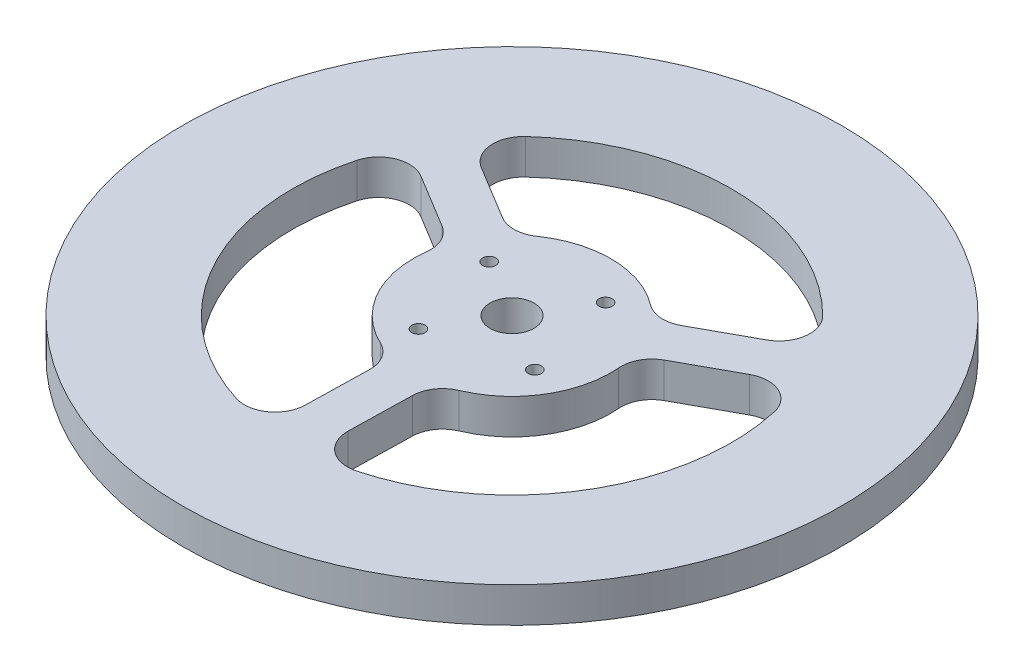
ISO-10303-21;
HEADER;
FILE_DESCRIPTION(('STEP AP214'),'2;1');
FILE_NAME('part.step','',(''),(''),'','','');
FILE_SCHEMA(('AUTOMOTIVE_DESIGN { 1 0 10303 214 1 1 1 1 }'));
ENDSEC;
DATA;
#1=APPLICATION_CONTEXT('core data for automotive mechanical design processes');
#2=APPLICATION_PROTOCOL_DEFINITION('international standard','automotive_design',2000,#1);
#3=PRODUCT_CONTEXT('',#1,'mechanical');
#4=PRODUCT('Part','Part','',(#3));
#5=PRODUCT_RELATED_PRODUCT_CATEGORY('part','',(#4));
#6=PRODUCT_DEFINITION_FORMATION('','',#4);
#7=PRODUCT_DEFINITION_CONTEXT('part definition',#1,'design');
#8=PRODUCT_DEFINITION('design','',#6,#7);
#9=PRODUCT_DEFINITION_SHAPE('','',#8);
#10=(LENGTH_UNIT() NAMED_UNIT(*) SI_UNIT(.MILLI.,.METRE.));
#11=(NAMED_UNIT(*) PLANE_ANGLE_UNIT() SI_UNIT($,.RADIAN.));
#12=(NAMED_UNIT(*) SI_UNIT($,.STERADIAN.) SOLID_ANGLE_UNIT());
#13=UNCERTAINTY_MEASURE_WITH_UNIT(LENGTH_MEASURE(1.E-05),#10,'distance_accuracy_value','');
#14=(GEOMETRIC_REPRESENTATION_CONTEXT(3) GLOBAL_UNCERTAINTY_ASSIGNED_CONTEXT((#13)) GLOBAL_UNIT_ASSIGNED_CONTEXT((#10,
#11,#12)) REPRESENTATION_CONTEXT('',''));
#15=CARTESIAN_POINT('',(0.,0.,0.));
#16=DIRECTION('',(0.,0.,1.));
#17=DIRECTION('',(1.,0.,0.));
#18=AXIS2_PLACEMENT_3D('',#15,#16,#17);
#19=CARTESIAN_POINT('',(0.,8.,0.));
#20=DIRECTION('',(0.,1.,0.));
#21=DIRECTION('',(0.,0.,1.));
#22=AXIS2_PLACEMENT_3D('',#19,#20,#21);
#23=PLANE('',#22);
#24=CARTESIAN_POINT('',(-13.2486768412093,8.,-8.04503337203794));
#25=DIRECTION('',(0.,1.,0.));
#26=DIRECTION('',(0.,0.,1.));
#27=AXIS2_PLACEMENT_3D('',#24,#25,#26);
#28=CIRCLE('',#27,1.5);
#29=CARTESIAN_POINT('',(-13.2486768412093,8.,-6.54503337203794));
#30=VERTEX_POINT('',#29);
#31=EDGE_CURVE('E288',#30,#30,#28,.T.);
#32=ORIENTED_EDGE('',*,*,#31,.F.);
#33=EDGE_LOOP('',(#32));
#34=FACE_BOUND('',#33,.T.);
#35=CARTESIAN_POINT('',(8.04503337203799,8.,-13.2486768412093));
#36=DIRECTION('',(0.,1.,0.));
#37=DIRECTION('',(0.,0.,1.));
#38=AXIS2_PLACEMENT_3D('',#35,#36,#37);
#39=CIRCLE('',#38,1.5);
#40=CARTESIAN_POINT('',(8.04503337203799,8.,-11.7486768412093));
#41=VERTEX_POINT('',#40);
#42=EDGE_CURVE('E775',#41,#41,#39,.T.);
#43=ORIENTED_EDGE('',*,*,#42,.F.);
#44=EDGE_LOOP('',(#43));
#45=FACE_BOUND('',#44,.T.);
#46=CARTESIAN_POINT('',(13.2486768412093,8.,8.04503337203803));
#47=DIRECTION('',(0.,1.,0.));
#48=DIRECTION('',(0.,0.,1.));
#49=AXIS2_PLACEMENT_3D('',#46,#47,#48);
#50=CIRCLE('',#49,1.5);
#51=CARTESIAN_POINT('',(13.2486768412093,8.,9.54503337203803));
#52=VERTEX_POINT('',#51);
#53=EDGE_CURVE('E773',#52,#52,#50,.T.);
#54=ORIENTED_EDGE('',*,*,#53,.F.);
#55=EDGE_LOOP('',(#54));
#56=FACE_BOUND('',#55,.T.);
#57=CARTESIAN_POINT('',(-8.04503337203808,8.,13.2486768412092));
#58=DIRECTION('',(0.,1.,0.));
#59=DIRECTION('',(0.,0.,1.));
#60=AXIS2_PLACEMENT_3D('',#57,#58,#59);
#61=CIRCLE('',#60,1.5);
#62=CARTESIAN_POINT('',(-8.04503337203808,8.,14.7486768412092));
#63=VERTEX_POINT('',#62);
#64=EDGE_CURVE('E769',#63,#63,#61,.T.);
#65=ORIENTED_EDGE('',*,*,#64,.F.);
#66=EDGE_LOOP('',(#65));
#67=FACE_BOUND('',#66,.T.);
#68=CARTESIAN_POINT('',(0.,8.,0.));
#69=DIRECTION('',(0.,1.,0.));
#70=DIRECTION('',(0.,0.,1.));
#71=AXIS2_PLACEMENT_3D('',#68,#69,#70);
#72=CIRCLE('',#71,5.);
#73=CARTESIAN_POINT('',(0.,8.,5.));
#74=VERTEX_POINT('',#73);
#75=EDGE_CURVE('E283',#74,#74,#72,.T.);
#76=ORIENTED_EDGE('',*,*,#75,.F.);
#77=EDGE_LOOP('',(#76));
#78=FACE_BOUND('',#77,.T.);
#79=CARTESIAN_POINT('',(0.,8.,0.));
#80=DIRECTION('',(0.,1.,0.));
#81=DIRECTION('',(0.,0.,1.));
#82=AXIS2_PLACEMENT_3D('',#79,#80,#81);
#83=CIRCLE('',#82,75.);
#84=CARTESIAN_POINT('',(0.,8.,75.));
#85=VERTEX_POINT('',#84);
#86=EDGE_CURVE('E222',#85,#85,#83,.T.);
#87=ORIENTED_EDGE('',*,*,#86,.T.);
#88=EDGE_LOOP('',(#87));
#89=FACE_BOUND('',#88,.T.);
#90=DIRECTION('',(-0.854753344594149,0.,-0.519034411099222));
#91=VECTOR('',#90,1.);
#92=CARTESIAN_POINT('',(-45.1186140402983,8.,-21.5478692005172));
#93=LINE('',#92,#91);
#94=CARTESIAN_POINT('',(-25.6299421253038,8.,-9.71370509401931));
#95=VERTEX_POINT('',#94);
#96=CARTESIAN_POINT('',(-37.8893442736085,8.,-17.1580182572455));
#97=VERTEX_POINT('',#96);
#98=EDGE_CURVE('E395',#95,#97,#93,.T.);
#99=ORIENTED_EDGE('',*,*,#98,.F.);
#100=CARTESIAN_POINT('',(-29.2631830029984,8.,-3.73043168186027));
#101=DIRECTION('',(0.,1.,0.));
#102=DIRECTION('',(0.,0.,1.));
#103=AXIS2_PLACEMENT_3D('',#100,#101,#102);
#104=CIRCLE('',#103,7.);
#105=CARTESIAN_POINT('',(-22.3193768666937,8.,-2.84524450311376));
#106=VERTEX_POINT('',#105);
#107=EDGE_CURVE('E327',#95,#106,#104,.F.);
#108=ORIENTED_EDGE('',*,*,#107,.T.);
#109=CARTESIAN_POINT('',(0.,8.,0.));
#110=DIRECTION('',(0.,-1.,0.));
#111=DIRECTION('',(0.,0.,1.));
#112=AXIS2_PLACEMENT_3D('',#109,#110,#111);
#113=CIRCLE('',#112,22.5);
#114=CARTESIAN_POINT('',(-9.60497136959687,8.,20.3468554078812));
#115=VERTEX_POINT('',#114);
#116=EDGE_CURVE('E392',#115,#106,#113,.T.);
#117=ORIENTED_EDGE('',*,*,#116,.F.);
#118=CARTESIAN_POINT('',(-12.5931846845826,8.,26.6769882014442));
#119=DIRECTION('',(0.,1.,0.));
#120=DIRECTION('',(0.,0.,1.));
#121=AXIS2_PLACEMENT_3D('',#118,#119,#120);
#122=CIRCLE('',#121,7.);
#123=CARTESIAN_POINT('',(-5.59489747301755,8.,26.8318303935162));
#124=VERTEX_POINT('',#123);
#125=EDGE_CURVE('E331',#115,#124,#122,.F.);
#126=ORIENTED_EDGE('',*,*,#125,.T.);
#127=DIRECTION('',(0.0221203131531426,0.,-0.999755315937858));
#128=VECTOR('',#127,1.);
#129=CARTESIAN_POINT('',(-5.48403898008126,8.,21.821441667886));
#130=LINE('',#129,#128);
#131=CARTESIAN_POINT('',(-5.91216071194593,8.,41.1709406707707));
#132=VERTEX_POINT('',#131);
#133=EDGE_CURVE('E401',#132,#124,#130,.T.);
#134=ORIENTED_EDGE('',*,*,#133,.F.);
#135=CARTESIAN_POINT('',(-12.9104479235109,8.,41.0160984786987));
#136=DIRECTION('',(0.,1.,0.));
#137=DIRECTION('',(0.,0.,1.));
#138=AXIS2_PLACEMENT_3D('',#135,#136,#137);
#139=CIRCLE('',#138,7.);
#140=CARTESIAN_POINT('',(-15.0121487482685,8.,47.6931377659288));
#141=VERTEX_POINT('',#140);
#142=EDGE_CURVE('E276',#132,#141,#139,.F.);
#143=ORIENTED_EDGE('',*,*,#142,.T.);
#144=CARTESIAN_POINT('',(0.,8.,0.));
#145=DIRECTION('',(0.,1.,0.));
#146=DIRECTION('',(0.,0.,1.));
#147=AXIS2_PLACEMENT_3D('',#144,#145,#146);
#148=CIRCLE('',#147,50.);
#149=CARTESIAN_POINT('',(-48.2820757573291,8.,-12.9938893547517));
#150=VERTEX_POINT('',#149);
#151=EDGE_CURVE('E398',#150,#141,#148,.T.);
#152=ORIENTED_EDGE('',*,*,#151,.F.);
#153=CARTESIAN_POINT('',(-41.5225851513031,8.,-11.1747448450865));
#154=DIRECTION('',(0.,1.,0.));
#155=DIRECTION('',(0.,0.,1.));
#156=AXIS2_PLACEMENT_3D('',#153,#154,#155);
#157=CIRCLE('',#156,7.);
#158=EDGE_CURVE('E271',#150,#97,#157,.F.);
#159=ORIENTED_EDGE('',*,*,#158,.T.);
#160=EDGE_LOOP('',(#99,#108,#117,#126,#134,#143,#152,#159));
#161=FACE_BOUND('',#160,.T.);
#162=DIRECTION('',(0.876873657747292,0.,-0.480720904838644));
#163=VECTOR('',#162,1.);
#164=CARTESIAN_POINT('',(16.8327332732436,8.,-14.9301403393215));
#165=LINE('',#164,#163);
#166=CARTESIAN_POINT('',(21.2272864389427,8.,-17.3393284310286));
#167=VERTEX_POINT('',#166);
#168=CARTESIAN_POINT('',(33.8039518261758,8.,-24.234125545057));
#169=VERTEX_POINT('',#168);
#170=EDGE_CURVE('E220',#167,#169,#165,.T.);
#171=ORIENTED_EDGE('',*,*,#170,.F.);
#172=CARTESIAN_POINT('',(17.8622401050722,8.,-23.4774440352597));
#173=DIRECTION('',(0.,1.,0.));
#174=DIRECTION('',(0.,0.,1.));
#175=AXIS2_PLACEMENT_3D('',#172,#173,#174);
#176=CIRCLE('',#175,7.);
#177=CARTESIAN_POINT('',(13.6237424530212,8.,-17.9065251116387));
#178=VERTEX_POINT('',#177);
#179=EDGE_CURVE('E338',#167,#178,#176,.F.);
#180=ORIENTED_EDGE('',*,*,#179,.T.);
#181=CARTESIAN_POINT('',(0.,8.,0.));
#182=DIRECTION('',(0.,-1.,0.));
#183=DIRECTION('',(0.,0.,1.));
#184=AXIS2_PLACEMENT_3D('',#181,#182,#183);
#185=CIRCLE('',#184,22.5);
#186=CARTESIAN_POINT('',(-12.8184079855554,8.,-18.4915769126338));
#187=VERTEX_POINT('',#186);
#188=EDGE_CURVE('E377',#187,#178,#185,.T.);
#189=ORIENTED_EDGE('',*,*,#188,.F.);
#190=CARTESIAN_POINT('',(-16.806357136617,8.,-24.2445119521198));
#191=DIRECTION('',(0.,1.,0.));
#192=DIRECTION('',(0.,0.,1.));
#193=AXIS2_PLACEMENT_3D('',#190,#191,#192);
#194=CIRCLE('',#193,7.);
#195=CARTESIAN_POINT('',(-20.4395980143116,8.,-18.2612385399608));
#196=VERTEX_POINT('',#195);
#197=EDGE_CURVE('E335',#187,#196,#194,.F.);
#198=ORIENTED_EDGE('',*,*,#197,.T.);
#199=DIRECTION('',(0.854753344594149,0.,0.519034411099222));
#200=VECTOR('',#199,1.);
#201=CARTESIAN_POINT('',(-39.9282699293061,8.,-30.0954026464587));
#202=LINE('',#201,#200);
#203=CARTESIAN_POINT('',(-32.6990001626163,8.,-25.705551703187));
#204=VERTEX_POINT('',#203);
#205=EDGE_CURVE('E385',#204,#196,#202,.T.);
#206=ORIENTED_EDGE('',*,*,#205,.F.);
#207=CARTESIAN_POINT('',(-29.0657592849217,8.,-31.6888251153461));
#208=DIRECTION('',(0.,1.,0.));
#209=DIRECTION('',(0.,0.,1.));
#210=AXIS2_PLACEMENT_3D('',#207,#208,#209);
#211=CIRCLE('',#210,7.);
#212=CARTESIAN_POINT('',(-33.7973945173508,8.,-36.8474710643559));
#213=VERTEX_POINT('',#212);
#214=EDGE_CURVE('E238',#204,#213,#211,.F.);
#215=ORIENTED_EDGE('',*,*,#214,.T.);
#216=CARTESIAN_POINT('',(0.,8.,0.));
#217=DIRECTION('',(0.,1.,0.));
#218=DIRECTION('',(0.,0.,1.));
#219=AXIS2_PLACEMENT_3D('',#216,#217,#218);
#220=CIRCLE('',#219,50.);
#221=CARTESIAN_POINT('',(35.3940761538434,8.,-35.3165594759163));
#222=VERTEX_POINT('',#221);
#223=EDGE_CURVE('E382',#222,#213,#220,.T.);
#224=ORIENTED_EDGE('',*,*,#223,.F.);
#225=CARTESIAN_POINT('',(30.4389054923053,8.,-30.372241149288));
#226=DIRECTION('',(0.,1.,0.));
#227=DIRECTION('',(0.,0.,1.));
#228=AXIS2_PLACEMENT_3D('',#225,#226,#227);
#229=CIRCLE('',#228,7.);
#230=EDGE_CURVE('E216',#222,#169,#229,.F.);
#231=ORIENTED_EDGE('',*,*,#230,.T.);
#232=EDGE_LOOP('',(#171,#180,#189,#198,#206,#215,#224,#231));
#233=FACE_BOUND('',#232,.T.);
#234=DIRECTION('',(-0.0221203131531426,0.,0.999755315937858));
#235=VECTOR('',#234,1.);
#236=CARTESIAN_POINT('',(4.51351417929733,8.,22.0426447994174));
#237=LINE('',#236,#235);
#238=CARTESIAN_POINT('',(4.40265568636104,8.,27.0530335250477));
#239=VERTEX_POINT('',#238);
#240=CARTESIAN_POINT('',(4.08539244743265,8.,41.3921438023022));
#241=VERTEX_POINT('',#240);
#242=EDGE_CURVE('E513',#239,#241,#237,.T.);
#243=ORIENTED_EDGE('',*,*,#242,.F.);
#244=CARTESIAN_POINT('',(11.400942897926,8.,27.2078757171197));
#245=DIRECTION('',(0.,1.,0.));
#246=DIRECTION('',(0.,0.,1.));
#247=AXIS2_PLACEMENT_3D('',#244,#245,#246);
#248=CIRCLE('',#247,7.);
#249=CARTESIAN_POINT('',(8.69563441367241,8.,20.7517696147523));
#250=VERTEX_POINT('',#249);
#251=EDGE_CURVE('E11',#239,#250,#248,.F.);
#252=ORIENTED_EDGE('',*,*,#251,.T.);
#253=CARTESIAN_POINT('',(0.,8.,0.));
#254=DIRECTION('',(0.,-1.,0.));
#255=DIRECTION('',(0.,0.,1.));
#256=AXIS2_PLACEMENT_3D('',#253,#254,#255);
#257=CIRCLE('',#256,22.5);
#258=CARTESIAN_POINT('',(22.4233793551523,8.,-1.85527849524762));
#259=VERTEX_POINT('',#258);
#260=EDGE_CURVE('E351',#259,#250,#257,.T.);
#261=ORIENTED_EDGE('',*,*,#260,.F.);
#262=CARTESIAN_POINT('',(29.3995418211997,8.,-2.43247624932466));
#263=DIRECTION('',(0.,1.,0.));
#264=DIRECTION('',(0.,0.,1.));
#265=AXIS2_PLACEMENT_3D('',#262,#263,#264);
#266=CIRCLE('',#265,7.);
#267=CARTESIAN_POINT('',(26.0344954873292,8.,-8.5705918535557));
#268=VERTEX_POINT('',#267);
#269=EDGE_CURVE('E342',#259,#268,#266,.F.);
#270=ORIENTED_EDGE('',*,*,#269,.T.);
#271=DIRECTION('',(-0.876873657747292,0.,0.480720904838645));
#272=VECTOR('',#271,1.);
#273=CARTESIAN_POINT('',(21.6399423216301,8.,-6.16140376184863));
#274=LINE('',#273,#272);
#275=CARTESIAN_POINT('',(38.6111608745623,8.,-15.4653889675841));
#276=VERTEX_POINT('',#275);
#277=EDGE_CURVE('E348',#276,#268,#274,.T.);
#278=ORIENTED_EDGE('',*,*,#277,.F.);
#279=CARTESIAN_POINT('',(41.9762072084328,8.,-9.32727336335305));
#280=DIRECTION('',(0.,1.,0.));
#281=DIRECTION('',(0.,0.,1.));
#282=AXIS2_PLACEMENT_3D('',#279,#280,#281);
#283=CIRCLE('',#282,7.);
#284=CARTESIAN_POINT('',(48.8095432656195,8.,-10.8456667015733));
#285=VERTEX_POINT('',#284);
#286=EDGE_CURVE('E267',#276,#285,#283,.F.);
#287=ORIENTED_EDGE('',*,*,#286,.T.);
#288=CARTESIAN_POINT('',(0.,8.,0.));
#289=DIRECTION('',(0.,1.,0.));
#290=DIRECTION('',(0.,0.,1.));
#291=AXIS2_PLACEMENT_3D('',#288,#289,#290);
#292=CIRCLE('',#291,50.);
#293=CARTESIAN_POINT('',(12.8879996034857,8.,48.3104488306676));
#294=VERTEX_POINT('',#293);
#295=EDGE_CURVE('E360',#294,#285,#292,.T.);
#296=ORIENTED_EDGE('',*,*,#295,.F.);
#297=CARTESIAN_POINT('',(11.0836796589977,8.,41.5469859943741));
#298=DIRECTION('',(0.,1.,0.));
#299=DIRECTION('',(0.,0.,1.));
#300=AXIS2_PLACEMENT_3D('',#297,#298,#299);
#301=CIRCLE('',#300,7.);
#302=EDGE_CURVE('E262',#294,#241,#301,.F.);
#303=ORIENTED_EDGE('',*,*,#302,.T.);
#304=EDGE_LOOP('',(#243,#252,#261,#270,#278,#287,#296,#303));
#305=FACE_BOUND('',#304,.T.);
#306=ADVANCED_FACE('F35',(#34,#45,#56,#67,#78,#89,#161,#233,#305),#23,.T.);
#307=CARTESIAN_POINT('',(0.,0.,0.));
#308=DIRECTION('',(0.,1.,0.));
#309=DIRECTION('',(0.,0.,1.));
#310=AXIS2_PLACEMENT_3D('',#307,#308,#309);
#311=PLANE('',#310);
#312=CARTESIAN_POINT('',(-13.2486768412093,0.,-8.04503337203794));
#313=DIRECTION('',(0.,1.,0.));
#314=DIRECTION('',(0.,0.,1.));
#315=AXIS2_PLACEMENT_3D('',#312,#313,#314);
#316=CIRCLE('',#315,1.5);
#317=CARTESIAN_POINT('',(-13.2486768412093,0.,-6.54503337203794));
#318=VERTEX_POINT('',#317);
#319=EDGE_CURVE('E294',#318,#318,#316,.T.);
#320=ORIENTED_EDGE('',*,*,#319,.T.);
#321=EDGE_LOOP('',(#320));
#322=FACE_BOUND('',#321,.T.);
#323=CARTESIAN_POINT('',(8.04503337203799,0.,-13.2486768412093));
#324=DIRECTION('',(0.,1.,0.));
#325=DIRECTION('',(0.,0.,1.));
#326=AXIS2_PLACEMENT_3D('',#323,#324,#325);
#327=CIRCLE('',#326,1.5);
#328=CARTESIAN_POINT('',(8.04503337203799,0.,-11.7486768412093));
#329=VERTEX_POINT('',#328);
#330=EDGE_CURVE('E291',#329,#329,#327,.T.);
#331=ORIENTED_EDGE('',*,*,#330,.T.);
#332=EDGE_LOOP('',(#331));
#333=FACE_BOUND('',#332,.T.);
#334=CARTESIAN_POINT('',(13.2486768412093,0.,8.04503337203803));
#335=DIRECTION('',(0.,1.,0.));
#336=DIRECTION('',(0.,0.,1.));
#337=AXIS2_PLACEMENT_3D('',#334,#335,#336);
#338=CIRCLE('',#337,1.5);
#339=CARTESIAN_POINT('',(13.2486768412093,0.,9.54503337203803));
#340=VERTEX_POINT('',#339);
#341=EDGE_CURVE('E287',#340,#340,#338,.T.);
#342=ORIENTED_EDGE('',*,*,#341,.T.);
#343=EDGE_LOOP('',(#342));
#344=FACE_BOUND('',#343,.T.);
#345=CARTESIAN_POINT('',(-8.04503337203808,0.,13.2486768412092));
#346=DIRECTION('',(0.,1.,0.));
#347=DIRECTION('',(0.,0.,1.));
#348=AXIS2_PLACEMENT_3D('',#345,#346,#347);
#349=CIRCLE('',#348,1.5);
#350=CARTESIAN_POINT('',(-8.04503337203808,0.,14.7486768412092));
#351=VERTEX_POINT('',#350);
#352=EDGE_CURVE('E284',#351,#351,#349,.T.);
#353=ORIENTED_EDGE('',*,*,#352,.T.);
#354=EDGE_LOOP('',(#353));
#355=FACE_BOUND('',#354,.T.);
#356=CARTESIAN_POINT('',(0.,0.,0.));
#357=DIRECTION('',(0.,1.,0.));
#358=DIRECTION('',(0.,0.,1.));
#359=AXIS2_PLACEMENT_3D('',#356,#357,#358);
#360=CIRCLE('',#359,5.);
#361=CARTESIAN_POINT('',(0.,0.,5.));
#362=VERTEX_POINT('',#361);
#363=EDGE_CURVE('E279',#362,#362,#360,.T.);
#364=ORIENTED_EDGE('',*,*,#363,.T.);
#365=EDGE_LOOP('',(#364));
#366=FACE_BOUND('',#365,.T.);
#367=DIRECTION('',(0.854753344594149,0.,0.519034411099222));
#368=VECTOR('',#367,1.);
#369=CARTESIAN_POINT('',(-39.9282699293061,0.,-30.0954026464587));
#370=LINE('',#369,#368);
#371=CARTESIAN_POINT('',(-32.6990001626163,0.,-25.705551703187));
#372=VERTEX_POINT('',#371);
#373=CARTESIAN_POINT('',(-20.4395980143116,0.,-18.2612385399608));
#374=VERTEX_POINT('',#373);
#375=EDGE_CURVE('E380',#372,#374,#370,.T.);
#376=ORIENTED_EDGE('',*,*,#375,.T.);
#377=CARTESIAN_POINT('',(-16.806357136617,0.,-24.2445119521198));
#378=DIRECTION('',(0.,1.,0.));
#379=DIRECTION('',(0.,0.,1.));
#380=AXIS2_PLACEMENT_3D('',#377,#378,#379);
#381=CIRCLE('',#380,7.);
#382=CARTESIAN_POINT('',(-12.8184079855554,0.,-18.4915769126338));
#383=VERTEX_POINT('',#382);
#384=EDGE_CURVE('E333',#374,#383,#381,.T.);
#385=ORIENTED_EDGE('',*,*,#384,.T.);
#386=CARTESIAN_POINT('',(0.,0.,0.));
#387=DIRECTION('',(0.,-1.,0.));
#388=DIRECTION('',(0.,0.,1.));
#389=AXIS2_PLACEMENT_3D('',#386,#387,#388);
#390=CIRCLE('',#389,22.5);
#391=CARTESIAN_POINT('',(13.6237424530212,0.,-17.9065251116387));
#392=VERTEX_POINT('',#391);
#393=EDGE_CURVE('E207',#383,#392,#390,.T.);
#394=ORIENTED_EDGE('',*,*,#393,.T.);
#395=CARTESIAN_POINT('',(17.8622401050722,0.,-23.4774440352597));
#396=DIRECTION('',(0.,1.,0.));
#397=DIRECTION('',(0.,0.,1.));
#398=AXIS2_PLACEMENT_3D('',#395,#396,#397);
#399=CIRCLE('',#398,7.);
#400=CARTESIAN_POINT('',(21.2272864389427,0.,-17.3393284310286));
#401=VERTEX_POINT('',#400);
#402=EDGE_CURVE('E202',#392,#401,#399,.T.);
#403=ORIENTED_EDGE('',*,*,#402,.T.);
#404=DIRECTION('',(0.876873657747292,0.,-0.480720904838644));
#405=VECTOR('',#404,1.);
#406=CARTESIAN_POINT('',(16.8327332732436,0.,-14.9301403393215));
#407=LINE('',#406,#405);
#408=CARTESIAN_POINT('',(33.8039518261758,0.,-24.234125545057));
#409=VERTEX_POINT('',#408);
#410=EDGE_CURVE('E193',#401,#409,#407,.T.);
#411=ORIENTED_EDGE('',*,*,#410,.T.);
#412=CARTESIAN_POINT('',(30.4389054923053,0.,-30.372241149288));
#413=DIRECTION('',(0.,1.,0.));
#414=DIRECTION('',(0.,0.,1.));
#415=AXIS2_PLACEMENT_3D('',#412,#413,#414);
#416=CIRCLE('',#415,7.);
#417=CARTESIAN_POINT('',(35.3940761538434,0.,-35.3165594759163));
#418=VERTEX_POINT('',#417);
#419=EDGE_CURVE('E199',#409,#418,#416,.T.);
#420=ORIENTED_EDGE('',*,*,#419,.T.);
#421=CARTESIAN_POINT('',(0.,0.,0.));
#422=DIRECTION('',(0.,1.,0.));
#423=DIRECTION('',(0.,0.,1.));
#424=AXIS2_PLACEMENT_3D('',#421,#422,#423);
#425=CIRCLE('',#424,50.);
#426=CARTESIAN_POINT('',(-33.7973945173508,0.,-36.8474710643559));
#427=VERTEX_POINT('',#426);
#428=EDGE_CURVE('E206',#418,#427,#425,.T.);
#429=ORIENTED_EDGE('',*,*,#428,.T.);
#430=CARTESIAN_POINT('',(-29.0657592849217,0.,-31.6888251153461));
#431=DIRECTION('',(0.,1.,0.));
#432=DIRECTION('',(0.,0.,1.));
#433=AXIS2_PLACEMENT_3D('',#430,#431,#432);
#434=CIRCLE('',#433,7.);
#435=EDGE_CURVE('E236',#427,#372,#434,.T.);
#436=ORIENTED_EDGE('',*,*,#435,.T.);
#437=EDGE_LOOP('',(#376,#385,#394,#403,#411,#420,#429,#436));
#438=FACE_BOUND('',#437,.T.);
#439=CARTESIAN_POINT('',(0.,0.,0.));
#440=DIRECTION('',(0.,1.,0.));
#441=DIRECTION('',(0.,0.,1.));
#442=AXIS2_PLACEMENT_3D('',#439,#440,#441);
#443=CIRCLE('',#442,75.);
#444=CARTESIAN_POINT('',(0.,0.,75.));
#445=VERTEX_POINT('',#444);
#446=EDGE_CURVE('E226',#445,#445,#443,.T.);
#447=ORIENTED_EDGE('',*,*,#446,.F.);
#448=EDGE_LOOP('',(#447));
#449=FACE_BOUND('',#448,.T.);
#450=DIRECTION('',(0.0221203131531426,0.,-0.999755315937858));
#451=VECTOR('',#450,1.);
#452=CARTESIAN_POINT('',(-5.48403898008126,0.,21.821441667886));
#453=LINE('',#452,#451);
#454=CARTESIAN_POINT('',(-5.91216071194593,0.,41.1709406707707));
#455=VERTEX_POINT('',#454);
#456=CARTESIAN_POINT('',(-5.59489747301755,0.,26.8318303935162));
#457=VERTEX_POINT('',#456);
#458=EDGE_CURVE('E396',#455,#457,#453,.T.);
#459=ORIENTED_EDGE('',*,*,#458,.T.);
#460=CARTESIAN_POINT('',(-12.5931846845826,0.,26.6769882014442));
#461=DIRECTION('',(0.,1.,0.));
#462=DIRECTION('',(0.,0.,1.));
#463=AXIS2_PLACEMENT_3D('',#460,#461,#462);
#464=CIRCLE('',#463,7.);
#465=CARTESIAN_POINT('',(-9.60497136959687,0.,20.3468554078812));
#466=VERTEX_POINT('',#465);
#467=EDGE_CURVE('E329',#457,#466,#464,.T.);
#468=ORIENTED_EDGE('',*,*,#467,.T.);
#469=CARTESIAN_POINT('',(0.,0.,0.));
#470=DIRECTION('',(0.,-1.,0.));
#471=DIRECTION('',(0.,0.,1.));
#472=AXIS2_PLACEMENT_3D('',#469,#470,#471);
#473=CIRCLE('',#472,22.5);
#474=CARTESIAN_POINT('',(-22.3193768666937,0.,-2.84524450311376));
#475=VERTEX_POINT('',#474);
#476=EDGE_CURVE('E388',#466,#475,#473,.T.);
#477=ORIENTED_EDGE('',*,*,#476,.T.);
#478=CARTESIAN_POINT('',(-29.2631830029984,0.,-3.73043168186027));
#479=DIRECTION('',(0.,1.,0.));
#480=DIRECTION('',(0.,0.,1.));
#481=AXIS2_PLACEMENT_3D('',#478,#479,#480);
#482=CIRCLE('',#481,7.);
#483=CARTESIAN_POINT('',(-25.6299421253038,0.,-9.71370509401931));
#484=VERTEX_POINT('',#483);
#485=EDGE_CURVE('E325',#475,#484,#482,.T.);
#486=ORIENTED_EDGE('',*,*,#485,.T.);
#487=DIRECTION('',(-0.854753344594149,0.,-0.519034411099222));
#488=VECTOR('',#487,1.);
#489=CARTESIAN_POINT('',(-45.1186140402983,0.,-21.5478692005172));
#490=LINE('',#489,#488);
#491=CARTESIAN_POINT('',(-37.8893442736085,0.,-17.1580182572455));
#492=VERTEX_POINT('',#491);
#493=EDGE_CURVE('E406',#484,#492,#490,.T.);
#494=ORIENTED_EDGE('',*,*,#493,.T.);
#495=CARTESIAN_POINT('',(-41.5225851513031,0.,-11.1747448450865));
#496=DIRECTION('',(0.,1.,0.));
#497=DIRECTION('',(0.,0.,1.));
#498=AXIS2_PLACEMENT_3D('',#495,#496,#497);
#499=CIRCLE('',#498,7.);
#500=CARTESIAN_POINT('',(-48.2820757573291,0.,-12.9938893547517));
#501=VERTEX_POINT('',#500);
#502=EDGE_CURVE('E269',#492,#501,#499,.T.);
#503=ORIENTED_EDGE('',*,*,#502,.T.);
#504=CARTESIAN_POINT('',(0.,0.,0.));
#505=DIRECTION('',(0.,1.,0.));
#506=DIRECTION('',(0.,0.,1.));
#507=AXIS2_PLACEMENT_3D('',#504,#505,#506);
#508=CIRCLE('',#507,50.);
#509=CARTESIAN_POINT('',(-15.0121487482685,0.,47.6931377659288));
#510=VERTEX_POINT('',#509);
#511=EDGE_CURVE('E408',#501,#510,#508,.T.);
#512=ORIENTED_EDGE('',*,*,#511,.T.);
#513=CARTESIAN_POINT('',(-12.9104479235109,0.,41.0160984786987));
#514=DIRECTION('',(0.,1.,0.));
#515=DIRECTION('',(0.,0.,1.));
#516=AXIS2_PLACEMENT_3D('',#513,#514,#515);
#517=CIRCLE('',#516,7.);
#518=EDGE_CURVE('E274',#510,#455,#517,.T.);
#519=ORIENTED_EDGE('',*,*,#518,.T.);
#520=EDGE_LOOP('',(#459,#468,#477,#486,#494,#503,#512,#519));
#521=FACE_BOUND('',#520,.T.);
#522=DIRECTION('',(-0.876873657747292,0.,0.480720904838645));
#523=VECTOR('',#522,1.);
#524=CARTESIAN_POINT('',(21.6399423216301,0.,-6.16140376184863));
#525=LINE('',#524,#523);
#526=CARTESIAN_POINT('',(38.6111608745623,0.,-15.4653889675841));
#527=VERTEX_POINT('',#526);
#528=CARTESIAN_POINT('',(26.0344954873292,0.,-8.5705918535557));
#529=VERTEX_POINT('',#528);
#530=EDGE_CURVE('E364',#527,#529,#525,.T.);
#531=ORIENTED_EDGE('',*,*,#530,.T.);
#532=CARTESIAN_POINT('',(29.3995418211997,0.,-2.43247624932466));
#533=DIRECTION('',(0.,1.,0.));
#534=DIRECTION('',(0.,0.,1.));
#535=AXIS2_PLACEMENT_3D('',#532,#533,#534);
#536=CIRCLE('',#535,7.);
#537=CARTESIAN_POINT('',(22.4233793551523,0.,-1.85527849524762));
#538=VERTEX_POINT('',#537);
#539=EDGE_CURVE('E340',#529,#538,#536,.T.);
#540=ORIENTED_EDGE('',*,*,#539,.T.);
#541=CARTESIAN_POINT('',(0.,0.,0.));
#542=DIRECTION('',(0.,-1.,0.));
#543=DIRECTION('',(0.,0.,1.));
#544=AXIS2_PLACEMENT_3D('',#541,#542,#543);
#545=CIRCLE('',#544,22.5);
#546=CARTESIAN_POINT('',(8.69563441367241,0.,20.7517696147523));
#547=VERTEX_POINT('',#546);
#548=EDGE_CURVE('E282',#538,#547,#545,.T.);
#549=ORIENTED_EDGE('',*,*,#548,.T.);
#550=CARTESIAN_POINT('',(11.400942897926,0.,27.2078757171197));
#551=DIRECTION('',(0.,1.,0.));
#552=DIRECTION('',(0.,0.,1.));
#553=AXIS2_PLACEMENT_3D('',#550,#551,#552);
#554=CIRCLE('',#553,7.);
#555=CARTESIAN_POINT('',(4.40265568636104,0.,27.0530335250477));
#556=VERTEX_POINT('',#555);
#557=EDGE_CURVE('E43',#547,#556,#554,.T.);
#558=ORIENTED_EDGE('',*,*,#557,.T.);
#559=DIRECTION('',(-0.0221203131531426,0.,0.999755315937858));
#560=VECTOR('',#559,1.);
#561=CARTESIAN_POINT('',(4.51351417929733,0.,22.0426447994174));
#562=LINE('',#561,#560);
#563=CARTESIAN_POINT('',(4.08539244743265,0.,41.3921438023022));
#564=VERTEX_POINT('',#563);
#565=EDGE_CURVE('E368',#556,#564,#562,.T.);
#566=ORIENTED_EDGE('',*,*,#565,.T.);
#567=CARTESIAN_POINT('',(11.0836796589977,0.,41.5469859943741));
#568=DIRECTION('',(0.,1.,0.));
#569=DIRECTION('',(0.,0.,1.));
#570=AXIS2_PLACEMENT_3D('',#567,#568,#569);
#571=CIRCLE('',#570,7.);
#572=CARTESIAN_POINT('',(12.8879996034857,0.,48.3104488306676));
#573=VERTEX_POINT('',#572);
#574=EDGE_CURVE('E260',#564,#573,#571,.T.);
#575=ORIENTED_EDGE('',*,*,#574,.T.);
#576=CARTESIAN_POINT('',(0.,0.,0.));
#577=DIRECTION('',(0.,1.,0.));
#578=DIRECTION('',(0.,0.,1.));
#579=AXIS2_PLACEMENT_3D('',#576,#577,#578);
#580=CIRCLE('',#579,50.);
#581=CARTESIAN_POINT('',(48.8095432656195,0.,-10.8456667015733));
#582=VERTEX_POINT('',#581);
#583=EDGE_CURVE('E370',#573,#582,#580,.T.);
#584=ORIENTED_EDGE('',*,*,#583,.T.);
#585=CARTESIAN_POINT('',(41.9762072084328,0.,-9.32727336335305));
#586=DIRECTION('',(0.,1.,0.));
#587=DIRECTION('',(0.,0.,1.));
#588=AXIS2_PLACEMENT_3D('',#585,#586,#587);
#589=CIRCLE('',#588,7.);
#590=EDGE_CURVE('E265',#582,#527,#589,.T.);
#591=ORIENTED_EDGE('',*,*,#590,.T.);
#592=EDGE_LOOP('',(#531,#540,#549,#558,#566,#575,#584,#591));
#593=FACE_BOUND('',#592,.T.);
#594=ADVANCED_FACE('F196',(#322,#333,#344,#355,#366,#438,#449,#521,#593),#311,.F.);
#595=CARTESIAN_POINT('',(0.,8.,0.));
#596=DIRECTION('',(0.,-1.,0.));
#597=DIRECTION('',(0.,0.,-1.));
#598=AXIS2_PLACEMENT_3D('',#595,#596,#597);
#599=CYLINDRICAL_SURFACE('',#598,75.);
#600=ORIENTED_EDGE('',*,*,#86,.F.);
#601=EDGE_LOOP('',(#600));
#602=FACE_BOUND('',#601,.T.);
#603=ORIENTED_EDGE('',*,*,#446,.T.);
#604=EDGE_LOOP('',(#603));
#605=FACE_BOUND('',#604,.T.);
#606=ADVANCED_FACE('F456',(#602,#605),#599,.T.);
#607=CARTESIAN_POINT('',(0.,8.,0.));
#608=DIRECTION('',(0.,-1.,0.));
#609=DIRECTION('',(0.,0.,-1.));
#610=AXIS2_PLACEMENT_3D('',#607,#608,#609);
#611=CYLINDRICAL_SURFACE('',#610,22.5);
#612=ORIENTED_EDGE('',*,*,#116,.T.);
#613=DIRECTION('',(0.,-1.,0.));
#614=VECTOR('',#613,1.);
#615=CARTESIAN_POINT('',(-22.3193768666937,8.,-2.84524450311376));
#616=LINE('',#615,#614);
#617=EDGE_CURVE('E298',#106,#475,#616,.T.);
#618=ORIENTED_EDGE('',*,*,#617,.T.);
#619=ORIENTED_EDGE('',*,*,#476,.F.);
#620=DIRECTION('',(0.,-1.,0.));
#621=VECTOR('',#620,1.);
#622=CARTESIAN_POINT('',(-9.60497136959687,8.,20.3468554078812));
#623=LINE('',#622,#621);
#624=EDGE_CURVE('E278',#466,#115,#623,.F.);
#625=ORIENTED_EDGE('',*,*,#624,.T.);
#626=EDGE_LOOP('',(#612,#618,#619,#625));
#627=FACE_BOUND('',#626,.T.);
#628=ADVANCED_FACE('F445',(#627),#611,.T.);
#629=CARTESIAN_POINT('',(-45.1186140402983,8.,-21.5478692005172));
#630=DIRECTION('',(-0.519034411099222,0.,0.854753344594149));
#631=DIRECTION('',(0.854753344594149,0.,0.519034411099222));
#632=AXIS2_PLACEMENT_3D('',#629,#630,#631);
#633=PLANE('',#632);
#634=ORIENTED_EDGE('',*,*,#493,.F.);
#635=DIRECTION('',(0.,1.,0.));
#636=VECTOR('',#635,1.);
#637=CARTESIAN_POINT('',(-25.6299421253038,8.,-9.71370509401931));
#638=LINE('',#637,#636);
#639=EDGE_CURVE('E301',#484,#95,#638,.T.);
#640=ORIENTED_EDGE('',*,*,#639,.T.);
#641=ORIENTED_EDGE('',*,*,#98,.T.);
#642=DIRECTION('',(0.,1.,0.));
#643=VECTOR('',#642,1.);
#644=CARTESIAN_POINT('',(-37.8893442736085,0.,-17.1580182572455));
#645=LINE('',#644,#643);
#646=EDGE_CURVE('E250',#97,#492,#645,.F.);
#647=ORIENTED_EDGE('',*,*,#646,.T.);
#648=EDGE_LOOP('',(#634,#640,#641,#647));
#649=FACE_BOUND('',#648,.T.);
#650=ADVANCED_FACE('F448',(#649),#633,.T.);
#651=CARTESIAN_POINT('',(0.,8.,0.));
#652=DIRECTION('',(0.,-1.,0.));
#653=DIRECTION('',(0.,0.,-1.));
#654=AXIS2_PLACEMENT_3D('',#651,#652,#653);
#655=CYLINDRICAL_SURFACE('',#654,50.);
#656=ORIENTED_EDGE('',*,*,#511,.F.);
#657=DIRECTION('',(0.,-1.,0.));
#658=VECTOR('',#657,1.);
#659=CARTESIAN_POINT('',(-48.2820757573292,8.,-12.9938893547517));
#660=LINE('',#659,#658);
#661=EDGE_CURVE('E256',#501,#150,#660,.F.);
#662=ORIENTED_EDGE('',*,*,#661,.T.);
#663=ORIENTED_EDGE('',*,*,#151,.T.);
#664=DIRECTION('',(0.,-1.,0.));
#665=VECTOR('',#664,1.);
#666=CARTESIAN_POINT('',(-15.0121487482685,8.,47.6931377659288));
#667=LINE('',#666,#665);
#668=EDGE_CURVE('E253',#141,#510,#667,.T.);
#669=ORIENTED_EDGE('',*,*,#668,.T.);
#670=EDGE_LOOP('',(#656,#662,#663,#669));
#671=FACE_BOUND('',#670,.T.);
#672=ADVANCED_FACE('F431',(#671),#655,.F.);
#673=CARTESIAN_POINT('',(-5.48403898008126,8.,21.821441667886));
#674=DIRECTION('',(-0.999755315937858,0.,-0.0221203131531426));
#675=DIRECTION('',(-0.0221203131531426,0.,0.999755315937858));
#676=AXIS2_PLACEMENT_3D('',#673,#674,#675);
#677=PLANE('',#676);
#678=ORIENTED_EDGE('',*,*,#133,.T.);
#679=DIRECTION('',(0.,1.,0.));
#680=VECTOR('',#679,1.);
#681=CARTESIAN_POINT('',(-5.59489747301755,0.,26.8318303935162));
#682=LINE('',#681,#680);
#683=EDGE_CURVE('E303',#124,#457,#682,.F.);
#684=ORIENTED_EDGE('',*,*,#683,.T.);
#685=ORIENTED_EDGE('',*,*,#458,.F.);
#686=DIRECTION('',(0.,1.,0.));
#687=VECTOR('',#686,1.);
#688=CARTESIAN_POINT('',(-5.91216071194593,8.,41.1709406707707));
#689=LINE('',#688,#687);
#690=EDGE_CURVE('E258',#455,#132,#689,.T.);
#691=ORIENTED_EDGE('',*,*,#690,.T.);
#692=EDGE_LOOP('',(#678,#684,#685,#691));
#693=FACE_BOUND('',#692,.T.);
#694=ADVANCED_FACE('F417',(#693),#677,.T.);
#695=CARTESIAN_POINT('',(0.,8.,0.));
#696=DIRECTION('',(0.,-1.,0.));
#697=DIRECTION('',(0.,0.,-1.));
#698=AXIS2_PLACEMENT_3D('',#695,#696,#697);
#699=CYLINDRICAL_SURFACE('',#698,22.5);
#700=ORIENTED_EDGE('',*,*,#393,.F.);
#701=DIRECTION('',(0.,-1.,0.));
#702=VECTOR('',#701,1.);
#703=CARTESIAN_POINT('',(-12.8184079855554,8.,-18.4915769126338));
#704=LINE('',#703,#702);
#705=EDGE_CURVE('E312',#383,#187,#704,.F.);
#706=ORIENTED_EDGE('',*,*,#705,.T.);
#707=ORIENTED_EDGE('',*,*,#188,.T.);
#708=DIRECTION('',(0.,-1.,0.));
#709=VECTOR('',#708,1.);
#710=CARTESIAN_POINT('',(13.6237424530212,8.,-17.9065251116387));
#711=LINE('',#710,#709);
#712=EDGE_CURVE('E309',#178,#392,#711,.T.);
#713=ORIENTED_EDGE('',*,*,#712,.T.);
#714=EDGE_LOOP('',(#700,#706,#707,#713));
#715=FACE_BOUND('',#714,.T.);
#716=ADVANCED_FACE('F549',(#715),#699,.T.);
#717=CARTESIAN_POINT('',(16.8327332732436,8.,-14.9301403393215));
#718=DIRECTION('',(-0.480720904838644,0.,-0.876873657747292));
#719=DIRECTION('',(-0.876873657747292,0.,0.480720904838645));
#720=AXIS2_PLACEMENT_3D('',#717,#718,#719);
#721=PLANE('',#720);
#722=ORIENTED_EDGE('',*,*,#410,.F.);
#723=DIRECTION('',(0.,1.,0.));
#724=VECTOR('',#723,1.);
#725=CARTESIAN_POINT('',(21.2272864389427,8.,-17.3393284310286));
#726=LINE('',#725,#724);
#727=EDGE_CURVE('E314',#401,#167,#726,.T.);
#728=ORIENTED_EDGE('',*,*,#727,.T.);
#729=ORIENTED_EDGE('',*,*,#170,.T.);
#730=DIRECTION('',(0.,1.,0.));
#731=VECTOR('',#730,1.);
#732=CARTESIAN_POINT('',(33.8039518261758,0.,-24.234125545057));
#733=LINE('',#732,#731);
#734=EDGE_CURVE('E214',#169,#409,#733,.F.);
#735=ORIENTED_EDGE('',*,*,#734,.T.);
#736=EDGE_LOOP('',(#722,#728,#729,#735));
#737=FACE_BOUND('',#736,.T.);
#738=ADVANCED_FACE('F218',(#737),#721,.T.);
#739=CARTESIAN_POINT('',(0.,8.,0.));
#740=DIRECTION('',(0.,-1.,0.));
#741=DIRECTION('',(0.,0.,-1.));
#742=AXIS2_PLACEMENT_3D('',#739,#740,#741);
#743=CYLINDRICAL_SURFACE('',#742,50.);
#744=ORIENTED_EDGE('',*,*,#223,.T.);
#745=DIRECTION('',(0.,-1.,0.));
#746=VECTOR('',#745,1.);
#747=CARTESIAN_POINT('',(-33.7973945173509,8.,-36.8474710643559));
#748=LINE('',#747,#746);
#749=EDGE_CURVE('E231',#213,#427,#748,.T.);
#750=ORIENTED_EDGE('',*,*,#749,.T.);
#751=ORIENTED_EDGE('',*,*,#428,.F.);
#752=DIRECTION('',(0.,-1.,0.));
#753=VECTOR('',#752,1.);
#754=CARTESIAN_POINT('',(35.3940761538434,8.,-35.3165594759163));
#755=LINE('',#754,#753);
#756=EDGE_CURVE('E215',#418,#222,#755,.F.);
#757=ORIENTED_EDGE('',*,*,#756,.T.);
#758=EDGE_LOOP('',(#744,#750,#751,#757));
#759=FACE_BOUND('',#758,.T.);
#760=ADVANCED_FACE('F542',(#759),#743,.F.);
#761=CARTESIAN_POINT('',(-39.9282699293061,8.,-30.0954026464587));
#762=DIRECTION('',(0.519034411099223,0.,-0.854753344594149));
#763=DIRECTION('',(-0.854753344594149,0.,-0.519034411099222));
#764=AXIS2_PLACEMENT_3D('',#761,#762,#763);
#765=PLANE('',#764);
#766=ORIENTED_EDGE('',*,*,#205,.T.);
#767=DIRECTION('',(0.,1.,0.));
#768=VECTOR('',#767,1.);
#769=CARTESIAN_POINT('',(-20.4395980143116,0.,-18.2612385399608));
#770=LINE('',#769,#768);
#771=EDGE_CURVE('E306',#196,#374,#770,.F.);
#772=ORIENTED_EDGE('',*,*,#771,.T.);
#773=ORIENTED_EDGE('',*,*,#375,.F.);
#774=DIRECTION('',(0.,1.,0.));
#775=VECTOR('',#774,1.);
#776=CARTESIAN_POINT('',(-32.6990001626163,8.,-25.705551703187));
#777=LINE('',#776,#775);
#778=EDGE_CURVE('E234',#372,#204,#777,.T.);
#779=ORIENTED_EDGE('',*,*,#778,.T.);
#780=EDGE_LOOP('',(#766,#772,#773,#779));
#781=FACE_BOUND('',#780,.T.);
#782=ADVANCED_FACE('F536',(#781),#765,.T.);
#783=CARTESIAN_POINT('',(0.,8.,0.));
#784=DIRECTION('',(0.,-1.,0.));
#785=DIRECTION('',(0.,0.,-1.));
#786=AXIS2_PLACEMENT_3D('',#783,#784,#785);
#787=CYLINDRICAL_SURFACE('',#786,22.5);
#788=ORIENTED_EDGE('',*,*,#548,.F.);
#789=DIRECTION('',(0.,-1.,0.));
#790=VECTOR('',#789,1.);
#791=CARTESIAN_POINT('',(22.4233793551523,8.,-1.85527849524762));
#792=LINE('',#791,#790);
#793=EDGE_CURVE('E322',#538,#259,#792,.F.);
#794=ORIENTED_EDGE('',*,*,#793,.T.);
#795=ORIENTED_EDGE('',*,*,#260,.T.);
#796=DIRECTION('',(0.,-1.,0.));
#797=VECTOR('',#796,1.);
#798=CARTESIAN_POINT('',(8.69563441367241,8.,20.7517696147523));
#799=LINE('',#798,#797);
#800=EDGE_CURVE('E319',#250,#547,#799,.T.);
#801=ORIENTED_EDGE('',*,*,#800,.T.);
#802=EDGE_LOOP('',(#788,#794,#795,#801));
#803=FACE_BOUND('',#802,.T.);
#804=ADVANCED_FACE('F366',(#803),#787,.T.);
#805=CARTESIAN_POINT('',(4.51351417929733,8.,22.0426447994174));
#806=DIRECTION('',(0.999755315937858,0.,0.0221203131531426));
#807=DIRECTION('',(0.0221203131531426,0.,-0.999755315937858));
#808=AXIS2_PLACEMENT_3D('',#805,#806,#807);
#809=PLANE('',#808);
#810=ORIENTED_EDGE('',*,*,#565,.F.);
#811=DIRECTION('',(0.,1.,0.));
#812=VECTOR('',#811,1.);
#813=CARTESIAN_POINT('',(4.40265568636104,8.,27.0530335250477));
#814=LINE('',#813,#812);
#815=EDGE_CURVE('E56',#556,#239,#814,.T.);
#816=ORIENTED_EDGE('',*,*,#815,.T.);
#817=ORIENTED_EDGE('',*,*,#242,.T.);
#818=DIRECTION('',(0.,1.,0.));
#819=VECTOR('',#818,1.);
#820=CARTESIAN_POINT('',(4.08539244743265,0.,41.3921438023022));
#821=LINE('',#820,#819);
#822=EDGE_CURVE('E240',#241,#564,#821,.F.);
#823=ORIENTED_EDGE('',*,*,#822,.T.);
#824=EDGE_LOOP('',(#810,#816,#817,#823));
#825=FACE_BOUND('',#824,.T.);
#826=ADVANCED_FACE('F528',(#825),#809,.T.);
#827=CARTESIAN_POINT('',(0.,8.,0.));
#828=DIRECTION('',(0.,-1.,0.));
#829=DIRECTION('',(0.,0.,-1.));
#830=AXIS2_PLACEMENT_3D('',#827,#828,#829);
#831=CYLINDRICAL_SURFACE('',#830,50.);
#832=ORIENTED_EDGE('',*,*,#583,.F.);
#833=DIRECTION('',(0.,-1.,0.));
#834=VECTOR('',#833,1.);
#835=CARTESIAN_POINT('',(12.8879996034857,8.,48.3104488306676));
#836=LINE('',#835,#834);
#837=EDGE_CURVE('E246',#573,#294,#836,.F.);
#838=ORIENTED_EDGE('',*,*,#837,.T.);
#839=ORIENTED_EDGE('',*,*,#295,.T.);
#840=DIRECTION('',(0.,-1.,0.));
#841=VECTOR('',#840,1.);
#842=CARTESIAN_POINT('',(48.8095432656195,8.,-10.8456667015733));
#843=LINE('',#842,#841);
#844=EDGE_CURVE('E243',#285,#582,#843,.T.);
#845=ORIENTED_EDGE('',*,*,#844,.T.);
#846=EDGE_LOOP('',(#832,#838,#839,#845));
#847=FACE_BOUND('',#846,.T.);
#848=ADVANCED_FACE('F523',(#847),#831,.F.);
#849=CARTESIAN_POINT('',(21.6399423216301,8.,-6.16140376184863));
#850=DIRECTION('',(0.480720904838645,0.,0.876873657747292));
#851=DIRECTION('',(0.876873657747292,0.,-0.480720904838645));
#852=AXIS2_PLACEMENT_3D('',#849,#850,#851);
#853=PLANE('',#852);
#854=ORIENTED_EDGE('',*,*,#277,.T.);
#855=DIRECTION('',(0.,1.,0.));
#856=VECTOR('',#855,1.);
#857=CARTESIAN_POINT('',(26.0344954873292,0.,-8.57059185355571));
#858=LINE('',#857,#856);
#859=EDGE_CURVE('E316',#268,#529,#858,.F.);
#860=ORIENTED_EDGE('',*,*,#859,.T.);
#861=ORIENTED_EDGE('',*,*,#530,.F.);
#862=DIRECTION('',(0.,1.,0.));
#863=VECTOR('',#862,1.);
#864=CARTESIAN_POINT('',(38.6111608745623,8.,-15.4653889675841));
#865=LINE('',#864,#863);
#866=EDGE_CURVE('E248',#527,#276,#865,.T.);
#867=ORIENTED_EDGE('',*,*,#866,.T.);
#868=EDGE_LOOP('',(#854,#860,#861,#867));
#869=FACE_BOUND('',#868,.T.);
#870=ADVANCED_FACE('F356',(#869),#853,.T.);
#871=CARTESIAN_POINT('',(30.4389054923053,8.,-30.372241149288));
#872=DIRECTION('',(0.,-1.,0.));
#873=DIRECTION('',(0.,0.,-1.));
#874=AXIS2_PLACEMENT_3D('',#871,#872,#873);
#875=CYLINDRICAL_SURFACE('',#874,7.);
#876=ORIENTED_EDGE('',*,*,#230,.F.);
#877=ORIENTED_EDGE('',*,*,#756,.F.);
#878=ORIENTED_EDGE('',*,*,#419,.F.);
#879=ORIENTED_EDGE('',*,*,#734,.F.);
#880=EDGE_LOOP('',(#876,#877,#878,#879));
#881=FACE_BOUND('',#880,.T.);
#882=ADVANCED_FACE('F213',(#881),#875,.F.);
#883=CARTESIAN_POINT('',(-29.0657592849217,8.,-31.6888251153461));
#884=DIRECTION('',(0.,-1.,0.));
#885=DIRECTION('',(0.,0.,-1.));
#886=AXIS2_PLACEMENT_3D('',#883,#884,#885);
#887=CYLINDRICAL_SURFACE('',#886,7.);
#888=ORIENTED_EDGE('',*,*,#214,.F.);
#889=ORIENTED_EDGE('',*,*,#778,.F.);
#890=ORIENTED_EDGE('',*,*,#435,.F.);
#891=ORIENTED_EDGE('',*,*,#749,.F.);
#892=EDGE_LOOP('',(#888,#889,#890,#891));
#893=FACE_BOUND('',#892,.T.);
#894=ADVANCED_FACE('F474',(#893),#887,.F.);
#895=CARTESIAN_POINT('',(11.0836796589977,8.,41.5469859943741));
#896=DIRECTION('',(0.,-1.,0.));
#897=DIRECTION('',(0.,0.,-1.));
#898=AXIS2_PLACEMENT_3D('',#895,#896,#897);
#899=CYLINDRICAL_SURFACE('',#898,7.);
#900=ORIENTED_EDGE('',*,*,#302,.F.);
#901=ORIENTED_EDGE('',*,*,#837,.F.);
#902=ORIENTED_EDGE('',*,*,#574,.F.);
#903=ORIENTED_EDGE('',*,*,#822,.F.);
#904=EDGE_LOOP('',(#900,#901,#902,#903));
#905=FACE_BOUND('',#904,.T.);
#906=ADVANCED_FACE('F477',(#905),#899,.F.);
#907=CARTESIAN_POINT('',(41.9762072084328,8.,-9.32727336335305));
#908=DIRECTION('',(0.,-1.,0.));
#909=DIRECTION('',(0.,0.,-1.));
#910=AXIS2_PLACEMENT_3D('',#907,#908,#909);
#911=CYLINDRICAL_SURFACE('',#910,7.);
#912=ORIENTED_EDGE('',*,*,#286,.F.);
#913=ORIENTED_EDGE('',*,*,#866,.F.);
#914=ORIENTED_EDGE('',*,*,#590,.F.);
#915=ORIENTED_EDGE('',*,*,#844,.F.);
#916=EDGE_LOOP('',(#912,#913,#914,#915));
#917=FACE_BOUND('',#916,.T.);
#918=ADVANCED_FACE('F481',(#917),#911,.F.);
#919=CARTESIAN_POINT('',(-41.5225851513031,8.,-11.1747448450865));
#920=DIRECTION('',(0.,-1.,0.));
#921=DIRECTION('',(0.,0.,-1.));
#922=AXIS2_PLACEMENT_3D('',#919,#920,#921);
#923=CYLINDRICAL_SURFACE('',#922,7.);
#924=ORIENTED_EDGE('',*,*,#158,.F.);
#925=ORIENTED_EDGE('',*,*,#661,.F.);
#926=ORIENTED_EDGE('',*,*,#502,.F.);
#927=ORIENTED_EDGE('',*,*,#646,.F.);
#928=EDGE_LOOP('',(#924,#925,#926,#927));
#929=FACE_BOUND('',#928,.T.);
#930=ADVANCED_FACE('F435',(#929),#923,.F.);
#931=CARTESIAN_POINT('',(-12.9104479235109,8.,41.0160984786987));
#932=DIRECTION('',(0.,-1.,0.));
#933=DIRECTION('',(0.,0.,-1.));
#934=AXIS2_PLACEMENT_3D('',#931,#932,#933);
#935=CYLINDRICAL_SURFACE('',#934,7.);
#936=ORIENTED_EDGE('',*,*,#142,.F.);
#937=ORIENTED_EDGE('',*,*,#690,.F.);
#938=ORIENTED_EDGE('',*,*,#518,.F.);
#939=ORIENTED_EDGE('',*,*,#668,.F.);
#940=EDGE_LOOP('',(#936,#937,#938,#939));
#941=FACE_BOUND('',#940,.T.);
#942=ADVANCED_FACE('F422',(#941),#935,.F.);
#943=CARTESIAN_POINT('',(0.,-2.,0.));
#944=DIRECTION('',(0.,1.,0.));
#945=DIRECTION('',(0.,0.,1.));
#946=AXIS2_PLACEMENT_3D('',#943,#944,#945);
#947=CYLINDRICAL_SURFACE('',#946,5.);
#948=ORIENTED_EDGE('',*,*,#75,.T.);
#949=EDGE_LOOP('',(#948));
#950=FACE_BOUND('',#949,.T.);
#951=ORIENTED_EDGE('',*,*,#363,.F.);
#952=EDGE_LOOP('',(#951));
#953=FACE_BOUND('',#952,.T.);
#954=ADVANCED_FACE('F490',(#950,#953),#947,.F.);
#955=CARTESIAN_POINT('',(-8.04503337203808,-2.,13.2486768412092));
#956=DIRECTION('',(0.,1.,0.));
#957=DIRECTION('',(0.,0.,1.));
#958=AXIS2_PLACEMENT_3D('',#955,#956,#957);
#959=CYLINDRICAL_SURFACE('',#958,1.5);
#960=ORIENTED_EDGE('',*,*,#64,.T.);
#961=EDGE_LOOP('',(#960));
#962=FACE_BOUND('',#961,.T.);
#963=ORIENTED_EDGE('',*,*,#352,.F.);
#964=EDGE_LOOP('',(#963));
#965=FACE_BOUND('',#964,.T.);
#966=ADVANCED_FACE('F649',(#962,#965),#959,.F.);
#967=CARTESIAN_POINT('',(13.2486768412093,-2.,8.04503337203803));
#968=DIRECTION('',(0.,1.,0.));
#969=DIRECTION('',(0.,0.,1.));
#970=AXIS2_PLACEMENT_3D('',#967,#968,#969);
#971=CYLINDRICAL_SURFACE('',#970,1.5);
#972=ORIENTED_EDGE('',*,*,#53,.T.);
#973=EDGE_LOOP('',(#972));
#974=FACE_BOUND('',#973,.T.);
#975=ORIENTED_EDGE('',*,*,#341,.F.);
#976=EDGE_LOOP('',(#975));
#977=FACE_BOUND('',#976,.T.);
#978=ADVANCED_FACE('F641',(#974,#977),#971,.F.);
#979=CARTESIAN_POINT('',(8.04503337203799,-2.,-13.2486768412093));
#980=DIRECTION('',(0.,1.,0.));
#981=DIRECTION('',(0.,0.,1.));
#982=AXIS2_PLACEMENT_3D('',#979,#980,#981);
#983=CYLINDRICAL_SURFACE('',#982,1.5);
#984=ORIENTED_EDGE('',*,*,#42,.T.);
#985=EDGE_LOOP('',(#984));
#986=FACE_BOUND('',#985,.T.);
#987=ORIENTED_EDGE('',*,*,#330,.F.);
#988=EDGE_LOOP('',(#987));
#989=FACE_BOUND('',#988,.T.);
#990=ADVANCED_FACE('F634',(#986,#989),#983,.F.);
#991=CARTESIAN_POINT('',(-13.2486768412093,-2.,-8.04503337203794));
#992=DIRECTION('',(0.,1.,0.));
#993=DIRECTION('',(0.,0.,1.));
#994=AXIS2_PLACEMENT_3D('',#991,#992,#993);
#995=CYLINDRICAL_SURFACE('',#994,1.5);
#996=ORIENTED_EDGE('',*,*,#31,.T.);
#997=EDGE_LOOP('',(#996));
#998=FACE_BOUND('',#997,.T.);
#999=ORIENTED_EDGE('',*,*,#319,.F.);
#1000=EDGE_LOOP('',(#999));
#1001=FACE_BOUND('',#1000,.T.);
#1002=ADVANCED_FACE('F494',(#998,#1001),#995,.F.);
#1003=CARTESIAN_POINT('',(-29.2631830029984,8.,-3.73043168186027));
#1004=DIRECTION('',(0.,-1.,0.));
#1005=DIRECTION('',(0.,0.,-1.));
#1006=AXIS2_PLACEMENT_3D('',#1003,#1004,#1005);
#1007=CYLINDRICAL_SURFACE('',#1006,7.);
#1008=ORIENTED_EDGE('',*,*,#107,.F.);
#1009=ORIENTED_EDGE('',*,*,#639,.F.);
#1010=ORIENTED_EDGE('',*,*,#485,.F.);
#1011=ORIENTED_EDGE('',*,*,#617,.F.);
#1012=EDGE_LOOP('',(#1008,#1009,#1010,#1011));
#1013=FACE_BOUND('',#1012,.T.);
#1014=ADVANCED_FACE('F443',(#1013),#1007,.F.);
#1015=CARTESIAN_POINT('',(-12.5931846845826,8.,26.6769882014442));
#1016=DIRECTION('',(0.,-1.,0.));
#1017=DIRECTION('',(0.,0.,-1.));
#1018=AXIS2_PLACEMENT_3D('',#1015,#1016,#1017);
#1019=CYLINDRICAL_SURFACE('',#1018,7.);
#1020=ORIENTED_EDGE('',*,*,#125,.F.);
#1021=ORIENTED_EDGE('',*,*,#624,.F.);
#1022=ORIENTED_EDGE('',*,*,#467,.F.);
#1023=ORIENTED_EDGE('',*,*,#683,.F.);
#1024=EDGE_LOOP('',(#1020,#1021,#1022,#1023));
#1025=FACE_BOUND('',#1024,.T.);
#1026=ADVANCED_FACE('F493',(#1025),#1019,.F.);
#1027=CARTESIAN_POINT('',(-16.806357136617,8.,-24.2445119521198));
#1028=DIRECTION('',(0.,-1.,0.));
#1029=DIRECTION('',(0.,0.,-1.));
#1030=AXIS2_PLACEMENT_3D('',#1027,#1028,#1029);
#1031=CYLINDRICAL_SURFACE('',#1030,7.);
#1032=ORIENTED_EDGE('',*,*,#197,.F.);
#1033=ORIENTED_EDGE('',*,*,#705,.F.);
#1034=ORIENTED_EDGE('',*,*,#384,.F.);
#1035=ORIENTED_EDGE('',*,*,#771,.F.);
#1036=EDGE_LOOP('',(#1032,#1033,#1034,#1035));
#1037=FACE_BOUND('',#1036,.T.);
#1038=ADVANCED_FACE('F497',(#1037),#1031,.F.);
#1039=CARTESIAN_POINT('',(17.8622401050722,8.,-23.4774440352597));
#1040=DIRECTION('',(0.,-1.,0.));
#1041=DIRECTION('',(0.,0.,-1.));
#1042=AXIS2_PLACEMENT_3D('',#1039,#1040,#1041);
#1043=CYLINDRICAL_SURFACE('',#1042,7.);
#1044=ORIENTED_EDGE('',*,*,#179,.F.);
#1045=ORIENTED_EDGE('',*,*,#727,.F.);
#1046=ORIENTED_EDGE('',*,*,#402,.F.);
#1047=ORIENTED_EDGE('',*,*,#712,.F.);
#1048=EDGE_LOOP('',(#1044,#1045,#1046,#1047));
#1049=FACE_BOUND('',#1048,.T.);
#1050=ADVANCED_FACE('F501',(#1049),#1043,.F.);
#1051=CARTESIAN_POINT('',(29.3995418211997,8.,-2.43247624932466));
#1052=DIRECTION('',(0.,-1.,0.));
#1053=DIRECTION('',(0.,0.,-1.));
#1054=AXIS2_PLACEMENT_3D('',#1051,#1052,#1053);
#1055=CYLINDRICAL_SURFACE('',#1054,7.);
#1056=ORIENTED_EDGE('',*,*,#269,.F.);
#1057=ORIENTED_EDGE('',*,*,#793,.F.);
#1058=ORIENTED_EDGE('',*,*,#539,.F.);
#1059=ORIENTED_EDGE('',*,*,#859,.F.);
#1060=EDGE_LOOP('',(#1056,#1057,#1058,#1059));
#1061=FACE_BOUND('',#1060,.T.);
#1062=ADVANCED_FACE('F362',(#1061),#1055,.F.);
#1063=CARTESIAN_POINT('',(11.400942897926,8.,27.2078757171197));
#1064=DIRECTION('',(0.,-1.,0.));
#1065=DIRECTION('',(0.,0.,-1.));
#1066=AXIS2_PLACEMENT_3D('',#1063,#1064,#1065);
#1067=CYLINDRICAL_SURFACE('',#1066,7.);
#1068=ORIENTED_EDGE('',*,*,#251,.F.);
#1069=ORIENTED_EDGE('',*,*,#815,.F.);
#1070=ORIENTED_EDGE('',*,*,#557,.F.);
#1071=ORIENTED_EDGE('',*,*,#800,.F.);
#1072=EDGE_LOOP('',(#1068,#1069,#1070,#1071));
#1073=FACE_BOUND('',#1072,.T.);
#1074=ADVANCED_FACE('F37',(#1073),#1067,.F.);
#1075=CLOSED_SHELL('',(#306,#594,#606,#628,#650,#672,#694,#716,#738,#760,#782,#804,#826,#848,
#870,#882,#894,#906,#918,#930,#942,#954,#966,#978,#990,#1002,#1014,#1026,#1038,#1050,#1062,#1074));
#1076=MANIFOLD_SOLID_BREP('B2',#1075);
#1077=ADVANCED_BREP_SHAPE_REPRESENTATION('',(#18,#1076),#14);
#1078=SHAPE_DEFINITION_REPRESENTATION(#9,#1077);
ENDSEC;
END-ISO-10303-21;
